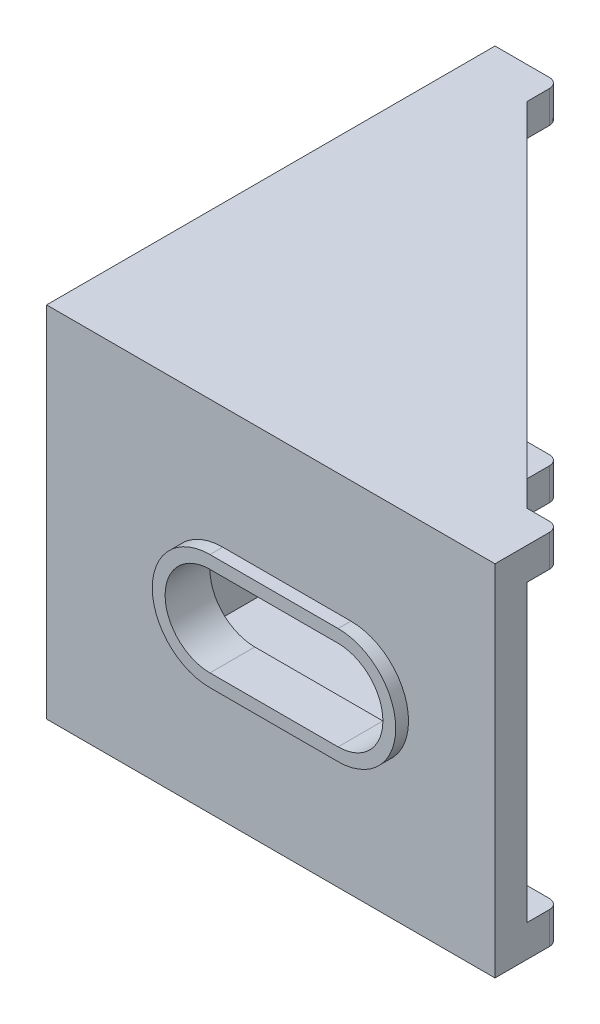
ISO-10303-21;
HEADER;
FILE_DESCRIPTION(('STEP AP214'),'2;1');
FILE_NAME('part.step','',(''),(''),'','','');
FILE_SCHEMA(('AUTOMOTIVE_DESIGN { 1 0 10303 214 1 1 1 1 }'));
ENDSEC;
DATA;
#1=APPLICATION_CONTEXT('core data for automotive mechanical design processes');
#2=APPLICATION_PROTOCOL_DEFINITION('international standard','automotive_design',2000,#1);
#3=PRODUCT_CONTEXT('',#1,'mechanical');
#4=PRODUCT('Part','Part','',(#3));
#5=PRODUCT_RELATED_PRODUCT_CATEGORY('part','',(#4));
#6=PRODUCT_DEFINITION_FORMATION('','',#4);
#7=PRODUCT_DEFINITION_CONTEXT('part definition',#1,'design');
#8=PRODUCT_DEFINITION('design','',#6,#7);
#9=PRODUCT_DEFINITION_SHAPE('','',#8);
#10=(LENGTH_UNIT() NAMED_UNIT(*) SI_UNIT(.MILLI.,.METRE.));
#11=(NAMED_UNIT(*) PLANE_ANGLE_UNIT() SI_UNIT($,.RADIAN.));
#12=(NAMED_UNIT(*) SI_UNIT($,.STERADIAN.) SOLID_ANGLE_UNIT());
#13=UNCERTAINTY_MEASURE_WITH_UNIT(LENGTH_MEASURE(1.E-05),#10,'distance_accuracy_value','');
#14=(GEOMETRIC_REPRESENTATION_CONTEXT(3) GLOBAL_UNCERTAINTY_ASSIGNED_CONTEXT((#13)) GLOBAL_UNIT_ASSIGNED_CONTEXT((#10,
#11,#12)) REPRESENTATION_CONTEXT('',''));
#15=CARTESIAN_POINT('',(0.,0.,0.));
#16=DIRECTION('',(0.,0.,1.));
#17=DIRECTION('',(1.,0.,0.));
#18=AXIS2_PLACEMENT_3D('',#15,#16,#17);
#19=CARTESIAN_POINT('',(0.,28.,0.));
#20=DIRECTION('',(1.,0.,0.));
#21=DIRECTION('',(0.,0.,-1.));
#22=AXIS2_PLACEMENT_3D('',#19,#20,#21);
#23=PLANE('',#22);
#24=DIRECTION('',(0.,0.,1.));
#25=VECTOR('',#24,1.);
#26=CARTESIAN_POINT('',(0.,0.,0.));
#27=LINE('',#26,#25);
#28=CARTESIAN_POINT('',(0.,0.,-35.));
#29=VERTEX_POINT('',#28);
#30=CARTESIAN_POINT('',(0.,0.,0.));
#31=VERTEX_POINT('',#30);
#32=EDGE_CURVE('E503',#29,#31,#27,.T.);
#33=ORIENTED_EDGE('',*,*,#32,.T.);
#34=DIRECTION('',(0.,-1.,0.));
#35=VECTOR('',#34,1.);
#36=CARTESIAN_POINT('',(0.,28.,0.));
#37=LINE('',#36,#35);
#38=CARTESIAN_POINT('',(0.,28.,0.));
#39=VERTEX_POINT('',#38);
#40=EDGE_CURVE('E509',#39,#31,#37,.T.);
#41=ORIENTED_EDGE('',*,*,#40,.F.);
#42=DIRECTION('',(0.,0.,1.));
#43=VECTOR('',#42,1.);
#44=CARTESIAN_POINT('',(0.,28.,0.));
#45=LINE('',#44,#43);
#46=CARTESIAN_POINT('',(0.,28.,-35.));
#47=VERTEX_POINT('',#46);
#48=EDGE_CURVE('E507',#47,#39,#45,.T.);
#49=ORIENTED_EDGE('',*,*,#48,.F.);
#50=DIRECTION('',(0.,-1.,0.));
#51=VECTOR('',#50,1.);
#52=CARTESIAN_POINT('',(0.,28.,-35.));
#53=LINE('',#52,#51);
#54=EDGE_CURVE('E519',#47,#29,#53,.T.);
#55=ORIENTED_EDGE('',*,*,#54,.T.);
#56=EDGE_LOOP('',(#33,#41,#49,#55));
#57=FACE_BOUND('',#56,.T.);
#58=CARTESIAN_POINT('',(0.,14.,-23.75));
#59=DIRECTION('',(-1.,0.,0.));
#60=DIRECTION('',(0.,0.,1.));
#61=AXIS2_PLACEMENT_3D('',#58,#59,#60);
#62=CIRCLE('',#61,4.5);
#63=CARTESIAN_POINT('',(0.,18.5,-23.75));
#64=VERTEX_POINT('',#63);
#65=CARTESIAN_POINT('',(0.,9.5,-23.75));
#66=VERTEX_POINT('',#65);
#67=EDGE_CURVE('E283',#64,#66,#62,.T.);
#68=ORIENTED_EDGE('',*,*,#67,.F.);
#69=DIRECTION('',(0.,0.,-1.));
#70=VECTOR('',#69,1.);
#71=CARTESIAN_POINT('',(0.,18.5,-23.75));
#72=LINE('',#71,#70);
#73=CARTESIAN_POINT('',(0.,18.5,-13.75));
#74=VERTEX_POINT('',#73);
#75=EDGE_CURVE('E288',#74,#64,#72,.T.);
#76=ORIENTED_EDGE('',*,*,#75,.F.);
#77=CARTESIAN_POINT('',(0.,14.,-13.75));
#78=DIRECTION('',(-1.,0.,0.));
#79=DIRECTION('',(0.,0.,1.));
#80=AXIS2_PLACEMENT_3D('',#77,#78,#79);
#81=CIRCLE('',#80,4.5);
#82=CARTESIAN_POINT('',(0.,9.5,-13.75));
#83=VERTEX_POINT('',#82);
#84=EDGE_CURVE('E54',#83,#74,#81,.T.);
#85=ORIENTED_EDGE('',*,*,#84,.F.);
#86=DIRECTION('',(0.,0.,1.));
#87=VECTOR('',#86,1.);
#88=CARTESIAN_POINT('',(0.,9.5,-13.75));
#89=LINE('',#88,#87);
#90=EDGE_CURVE('E49',#66,#83,#89,.T.);
#91=ORIENTED_EDGE('',*,*,#90,.F.);
#92=EDGE_LOOP('',(#68,#76,#85,#91));
#93=FACE_BOUND('',#92,.T.);
#94=ADVANCED_FACE('F34',(#57,#93),#23,.F.);
#95=CARTESIAN_POINT('',(0.,28.,0.));
#96=DIRECTION('',(0.,0.,-1.));
#97=DIRECTION('',(-1.,0.,0.));
#98=AXIS2_PLACEMENT_3D('',#95,#96,#97);
#99=PLANE('',#98);
#100=DIRECTION('',(1.,0.,0.));
#101=VECTOR('',#100,1.);
#102=CARTESIAN_POINT('',(0.,0.,0.));
#103=LINE('',#102,#101);
#104=CARTESIAN_POINT('',(35.,0.,0.));
#105=VERTEX_POINT('',#104);
#106=EDGE_CURVE('E488',#31,#105,#103,.T.);
#107=ORIENTED_EDGE('',*,*,#106,.T.);
#108=DIRECTION('',(0.,-1.,0.));
#109=VECTOR('',#108,1.);
#110=CARTESIAN_POINT('',(35.,28.,0.));
#111=LINE('',#110,#109);
#112=CARTESIAN_POINT('',(35.,28.,0.));
#113=VERTEX_POINT('',#112);
#114=EDGE_CURVE('E11',#113,#105,#111,.T.);
#115=ORIENTED_EDGE('',*,*,#114,.F.);
#116=DIRECTION('',(1.,0.,0.));
#117=VECTOR('',#116,1.);
#118=CARTESIAN_POINT('',(0.,28.,0.));
#119=LINE('',#118,#117);
#120=EDGE_CURVE('E499',#39,#113,#119,.T.);
#121=ORIENTED_EDGE('',*,*,#120,.F.);
#122=ORIENTED_EDGE('',*,*,#40,.T.);
#123=EDGE_LOOP('',(#107,#115,#121,#122));
#124=FACE_BOUND('',#123,.T.);
#125=CARTESIAN_POINT('',(13.75,14.,0.));
#126=DIRECTION('',(0.,0.,1.));
#127=DIRECTION('',(1.,0.,0.));
#128=AXIS2_PLACEMENT_3D('',#125,#126,#127);
#129=CIRCLE('',#128,4.5);
#130=CARTESIAN_POINT('',(13.75,18.5,0.));
#131=VERTEX_POINT('',#130);
#132=CARTESIAN_POINT('',(13.75,9.5,0.));
#133=VERTEX_POINT('',#132);
#134=EDGE_CURVE('E323',#131,#133,#129,.T.);
#135=ORIENTED_EDGE('',*,*,#134,.F.);
#136=DIRECTION('',(-1.,0.,0.));
#137=VECTOR('',#136,1.);
#138=CARTESIAN_POINT('',(13.75,18.5,0.));
#139=LINE('',#138,#137);
#140=CARTESIAN_POINT('',(23.75,18.5,0.));
#141=VERTEX_POINT('',#140);
#142=EDGE_CURVE('E328',#141,#131,#139,.T.);
#143=ORIENTED_EDGE('',*,*,#142,.F.);
#144=CARTESIAN_POINT('',(23.75,14.,0.));
#145=DIRECTION('',(0.,0.,1.));
#146=DIRECTION('',(1.,0.,0.));
#147=AXIS2_PLACEMENT_3D('',#144,#145,#146);
#148=CIRCLE('',#147,4.5);
#149=CARTESIAN_POINT('',(23.75,9.5,0.));
#150=VERTEX_POINT('',#149);
#151=EDGE_CURVE('E340',#150,#141,#148,.T.);
#152=ORIENTED_EDGE('',*,*,#151,.F.);
#153=DIRECTION('',(1.,0.,0.));
#154=VECTOR('',#153,1.);
#155=CARTESIAN_POINT('',(23.75,9.5,0.));
#156=LINE('',#155,#154);
#157=EDGE_CURVE('E337',#133,#150,#156,.T.);
#158=ORIENTED_EDGE('',*,*,#157,.F.);
#159=EDGE_LOOP('',(#135,#143,#152,#158));
#160=FACE_BOUND('',#159,.T.);
#161=ADVANCED_FACE('F36',(#124,#160),#99,.F.);
#162=CARTESIAN_POINT('',(2.5,28.,-2.5));
#163=DIRECTION('',(0.,0.,1.));
#164=DIRECTION('',(1.,0.,0.));
#165=AXIS2_PLACEMENT_3D('',#162,#163,#164);
#166=PLANE('',#165);
#167=DIRECTION('',(-1.,0.,0.));
#168=VECTOR('',#167,1.);
#169=CARTESIAN_POINT('',(23.75,10.5,-2.5));
#170=LINE('',#169,#168);
#171=CARTESIAN_POINT('',(23.75,10.5,-2.5));
#172=VERTEX_POINT('',#171);
#173=CARTESIAN_POINT('',(13.75,10.5,-2.5));
#174=VERTEX_POINT('',#173);
#175=EDGE_CURVE('E370',#172,#174,#170,.T.);
#176=ORIENTED_EDGE('',*,*,#175,.F.);
#177=CARTESIAN_POINT('',(23.75,14.,-2.5));
#178=DIRECTION('',(0.,0.,-1.));
#179=DIRECTION('',(-1.,0.,0.));
#180=AXIS2_PLACEMENT_3D('',#177,#178,#179);
#181=CIRCLE('',#180,3.5);
#182=CARTESIAN_POINT('',(23.75,17.5,-2.5));
#183=VERTEX_POINT('',#182);
#184=EDGE_CURVE('E263',#183,#172,#181,.T.);
#185=ORIENTED_EDGE('',*,*,#184,.F.);
#186=DIRECTION('',(1.,0.,0.));
#187=VECTOR('',#186,1.);
#188=CARTESIAN_POINT('',(23.75,17.5,-2.5));
#189=LINE('',#188,#187);
#190=CARTESIAN_POINT('',(13.75,17.5,-2.5));
#191=VERTEX_POINT('',#190);
#192=EDGE_CURVE('E376',#191,#183,#189,.T.);
#193=ORIENTED_EDGE('',*,*,#192,.F.);
#194=CARTESIAN_POINT('',(13.75,14.,-2.5));
#195=DIRECTION('',(0.,0.,-1.));
#196=DIRECTION('',(-1.,0.,0.));
#197=AXIS2_PLACEMENT_3D('',#194,#195,#196);
#198=CIRCLE('',#197,3.5);
#199=EDGE_CURVE('E373',#174,#191,#198,.T.);
#200=ORIENTED_EDGE('',*,*,#199,.F.);
#201=EDGE_LOOP('',(#176,#185,#193,#200));
#202=FACE_BOUND('',#201,.T.);
#203=DIRECTION('',(-1.,0.,0.));
#204=VECTOR('',#203,1.);
#205=CARTESIAN_POINT('',(0.,2.5,-2.5));
#206=LINE('',#205,#204);
#207=CARTESIAN_POINT('',(35.,2.5,-2.5));
#208=VERTEX_POINT('',#207);
#209=CARTESIAN_POINT('',(2.5,2.5,-2.5));
#210=VERTEX_POINT('',#209);
#211=EDGE_CURVE('E405',#208,#210,#206,.T.);
#212=ORIENTED_EDGE('',*,*,#211,.T.);
#213=DIRECTION('',(0.,-1.,0.));
#214=VECTOR('',#213,1.);
#215=CARTESIAN_POINT('',(2.5,28.,-2.5));
#216=LINE('',#215,#214);
#217=CARTESIAN_POINT('',(2.5,25.5,-2.5));
#218=VERTEX_POINT('',#217);
#219=EDGE_CURVE('E525',#218,#210,#216,.T.);
#220=ORIENTED_EDGE('',*,*,#219,.F.);
#221=DIRECTION('',(1.,0.,0.));
#222=VECTOR('',#221,1.);
#223=CARTESIAN_POINT('',(35.,25.5,-2.5));
#224=LINE('',#223,#222);
#225=CARTESIAN_POINT('',(35.,25.5,-2.5));
#226=VERTEX_POINT('',#225);
#227=EDGE_CURVE('E446',#218,#226,#224,.T.);
#228=ORIENTED_EDGE('',*,*,#227,.T.);
#229=DIRECTION('',(0.,-1.,0.));
#230=VECTOR('',#229,1.);
#231=CARTESIAN_POINT('',(35.,28.,-2.5));
#232=LINE('',#231,#230);
#233=EDGE_CURVE('E42',#226,#208,#232,.T.);
#234=ORIENTED_EDGE('',*,*,#233,.T.);
#235=EDGE_LOOP('',(#212,#220,#228,#234));
#236=FACE_BOUND('',#235,.T.);
#237=ADVANCED_FACE('F530',(#202,#236),#166,.F.);
#238=CARTESIAN_POINT('',(2.5,28.,-2.5));
#239=DIRECTION('',(-1.,0.,0.));
#240=DIRECTION('',(0.,0.,1.));
#241=AXIS2_PLACEMENT_3D('',#238,#239,#240);
#242=PLANE('',#241);
#243=DIRECTION('',(0.,0.,-1.));
#244=VECTOR('',#243,1.);
#245=CARTESIAN_POINT('',(2.5,10.5,-13.75));
#246=LINE('',#245,#244);
#247=CARTESIAN_POINT('',(2.5,10.5,-13.75));
#248=VERTEX_POINT('',#247);
#249=CARTESIAN_POINT('',(2.5,10.5,-23.75));
#250=VERTEX_POINT('',#249);
#251=EDGE_CURVE('E358',#248,#250,#246,.T.);
#252=ORIENTED_EDGE('',*,*,#251,.F.);
#253=CARTESIAN_POINT('',(2.5,14.,-13.75));
#254=DIRECTION('',(1.,0.,0.));
#255=DIRECTION('',(0.,0.,-1.));
#256=AXIS2_PLACEMENT_3D('',#253,#254,#255);
#257=CIRCLE('',#256,3.5);
#258=CARTESIAN_POINT('',(2.5,17.5,-13.75));
#259=VERTEX_POINT('',#258);
#260=EDGE_CURVE('E356',#259,#248,#257,.T.);
#261=ORIENTED_EDGE('',*,*,#260,.F.);
#262=DIRECTION('',(0.,0.,1.));
#263=VECTOR('',#262,1.);
#264=CARTESIAN_POINT('',(2.5,17.5,-13.75));
#265=LINE('',#264,#263);
#266=CARTESIAN_POINT('',(2.5,17.5,-23.75));
#267=VERTEX_POINT('',#266);
#268=EDGE_CURVE('E260',#267,#259,#265,.T.);
#269=ORIENTED_EDGE('',*,*,#268,.F.);
#270=CARTESIAN_POINT('',(2.5,14.,-23.75));
#271=DIRECTION('',(1.,0.,0.));
#272=DIRECTION('',(0.,0.,-1.));
#273=AXIS2_PLACEMENT_3D('',#270,#271,#272);
#274=CIRCLE('',#273,3.5);
#275=EDGE_CURVE('E361',#250,#267,#274,.T.);
#276=ORIENTED_EDGE('',*,*,#275,.F.);
#277=EDGE_LOOP('',(#252,#261,#269,#276));
#278=FACE_BOUND('',#277,.T.);
#279=DIRECTION('',(0.,0.,-1.));
#280=VECTOR('',#279,1.);
#281=CARTESIAN_POINT('',(2.5,2.5,0.));
#282=LINE('',#281,#280);
#283=CARTESIAN_POINT('',(2.5,2.5,-35.));
#284=VERTEX_POINT('',#283);
#285=EDGE_CURVE('E407',#210,#284,#282,.T.);
#286=ORIENTED_EDGE('',*,*,#285,.T.);
#287=DIRECTION('',(0.,-1.,0.));
#288=VECTOR('',#287,1.);
#289=CARTESIAN_POINT('',(2.5,28.,-35.));
#290=LINE('',#289,#288);
#291=CARTESIAN_POINT('',(2.5,25.5,-35.));
#292=VERTEX_POINT('',#291);
#293=EDGE_CURVE('E522',#292,#284,#290,.T.);
#294=ORIENTED_EDGE('',*,*,#293,.F.);
#295=DIRECTION('',(0.,0.,1.));
#296=VECTOR('',#295,1.);
#297=CARTESIAN_POINT('',(2.5,25.5,-2.5));
#298=LINE('',#297,#296);
#299=EDGE_CURVE('E443',#292,#218,#298,.T.);
#300=ORIENTED_EDGE('',*,*,#299,.T.);
#301=ORIENTED_EDGE('',*,*,#219,.T.);
#302=EDGE_LOOP('',(#286,#294,#300,#301));
#303=FACE_BOUND('',#302,.T.);
#304=ADVANCED_FACE('F567',(#278,#303),#242,.F.);
#305=CARTESIAN_POINT('',(35.,28.,-2.5));
#306=DIRECTION('',(-1.,0.,0.));
#307=DIRECTION('',(0.,0.,1.));
#308=AXIS2_PLACEMENT_3D('',#305,#306,#307);
#309=PLANE('',#308);
#310=DIRECTION('',(0.,0.,-1.));
#311=VECTOR('',#310,1.);
#312=CARTESIAN_POINT('',(35.,0.,-2.5));
#313=LINE('',#312,#311);
#314=CARTESIAN_POINT('',(35.,0.,-4.24999999999999));
#315=VERTEX_POINT('',#314);
#316=EDGE_CURVE('E512',#105,#315,#313,.T.);
#317=ORIENTED_EDGE('',*,*,#316,.T.);
#318=DIRECTION('',(0.,-1.,0.));
#319=VECTOR('',#318,1.);
#320=CARTESIAN_POINT('',(35.,2.5,-4.24999999999999));
#321=LINE('',#320,#319);
#322=CARTESIAN_POINT('',(35.,2.5,-4.24999999999999));
#323=VERTEX_POINT('',#322);
#324=EDGE_CURVE('E435',#323,#315,#321,.T.);
#325=ORIENTED_EDGE('',*,*,#324,.F.);
#326=DIRECTION('',(0.,0.,1.));
#327=VECTOR('',#326,1.);
#328=CARTESIAN_POINT('',(35.,2.5,0.));
#329=LINE('',#328,#327);
#330=EDGE_CURVE('E402',#323,#208,#329,.T.);
#331=ORIENTED_EDGE('',*,*,#330,.T.);
#332=ORIENTED_EDGE('',*,*,#233,.F.);
#333=DIRECTION('',(0.,0.,-1.));
#334=VECTOR('',#333,1.);
#335=CARTESIAN_POINT('',(35.,25.5,-4.24999999999999));
#336=LINE('',#335,#334);
#337=CARTESIAN_POINT('',(35.,25.5,-4.24999999999999));
#338=VERTEX_POINT('',#337);
#339=EDGE_CURVE('E450',#226,#338,#336,.T.);
#340=ORIENTED_EDGE('',*,*,#339,.T.);
#341=DIRECTION('',(0.,1.,0.));
#342=VECTOR('',#341,1.);
#343=CARTESIAN_POINT('',(35.,25.5,-4.24999999999999));
#344=LINE('',#343,#342);
#345=CARTESIAN_POINT('',(35.,28.,-4.24999999999999));
#346=VERTEX_POINT('',#345);
#347=EDGE_CURVE('E471',#338,#346,#344,.T.);
#348=ORIENTED_EDGE('',*,*,#347,.T.);
#349=DIRECTION('',(0.,0.,-1.));
#350=VECTOR('',#349,1.);
#351=CARTESIAN_POINT('',(35.,28.,-2.5));
#352=LINE('',#351,#350);
#353=EDGE_CURVE('E502',#113,#346,#352,.T.);
#354=ORIENTED_EDGE('',*,*,#353,.F.);
#355=ORIENTED_EDGE('',*,*,#114,.T.);
#356=EDGE_LOOP('',(#317,#325,#331,#332,#340,#348,#354,#355));
#357=FACE_BOUND('',#356,.T.);
#358=ADVANCED_FACE('F540',(#357),#309,.F.);
#359=CARTESIAN_POINT('',(0.,28.,-35.));
#360=DIRECTION('',(0.,0.,1.));
#361=DIRECTION('',(1.,0.,0.));
#362=AXIS2_PLACEMENT_3D('',#359,#360,#361);
#363=PLANE('',#362);
#364=DIRECTION('',(-1.,0.,0.));
#365=VECTOR('',#364,1.);
#366=CARTESIAN_POINT('',(0.,0.,-35.));
#367=LINE('',#366,#365);
#368=CARTESIAN_POINT('',(4.24999999999999,0.,-35.));
#369=VERTEX_POINT('',#368);
#370=EDGE_CURVE('E514',#369,#29,#367,.T.);
#371=ORIENTED_EDGE('',*,*,#370,.T.);
#372=ORIENTED_EDGE('',*,*,#54,.F.);
#373=DIRECTION('',(-1.,0.,0.));
#374=VECTOR('',#373,1.);
#375=CARTESIAN_POINT('',(0.,28.,-35.));
#376=LINE('',#375,#374);
#377=CARTESIAN_POINT('',(4.24999999999999,28.,-35.));
#378=VERTEX_POINT('',#377);
#379=EDGE_CURVE('E505',#378,#47,#376,.T.);
#380=ORIENTED_EDGE('',*,*,#379,.F.);
#381=DIRECTION('',(0.,1.,0.));
#382=VECTOR('',#381,1.);
#383=CARTESIAN_POINT('',(4.24999999999999,25.5,-35.));
#384=LINE('',#383,#382);
#385=CARTESIAN_POINT('',(4.24999999999999,25.5,-35.));
#386=VERTEX_POINT('',#385);
#387=EDGE_CURVE('E485',#386,#378,#384,.T.);
#388=ORIENTED_EDGE('',*,*,#387,.F.);
#389=DIRECTION('',(-1.,0.,0.));
#390=VECTOR('',#389,1.);
#391=CARTESIAN_POINT('',(2.5,25.5,-35.));
#392=LINE('',#391,#390);
#393=EDGE_CURVE('E468',#386,#292,#392,.T.);
#394=ORIENTED_EDGE('',*,*,#393,.T.);
#395=ORIENTED_EDGE('',*,*,#293,.T.);
#396=DIRECTION('',(1.,0.,0.));
#397=VECTOR('',#396,1.);
#398=CARTESIAN_POINT('',(0.,2.5,-35.));
#399=LINE('',#398,#397);
#400=CARTESIAN_POINT('',(4.24999999999999,2.5,-35.));
#401=VERTEX_POINT('',#400);
#402=EDGE_CURVE('E409',#284,#401,#399,.T.);
#403=ORIENTED_EDGE('',*,*,#402,.T.);
#404=DIRECTION('',(0.,-1.,0.));
#405=VECTOR('',#404,1.);
#406=CARTESIAN_POINT('',(4.24999999999999,2.5,-35.));
#407=LINE('',#406,#405);
#408=EDGE_CURVE('E432',#401,#369,#407,.T.);
#409=ORIENTED_EDGE('',*,*,#408,.T.);
#410=EDGE_LOOP('',(#371,#372,#380,#388,#394,#395,#403,#409));
#411=FACE_BOUND('',#410,.T.);
#412=ADVANCED_FACE('F563',(#411),#363,.F.);
#413=CARTESIAN_POINT('',(0.,28.,0.));
#414=DIRECTION('',(0.,-1.,0.));
#415=DIRECTION('',(0.,0.,-1.));
#416=AXIS2_PLACEMENT_3D('',#413,#414,#415);
#417=PLANE('',#416);
#418=CARTESIAN_POINT('',(4.25,28.,-34.25));
#419=DIRECTION('',(0.,1.,0.));
#420=DIRECTION('',(0.,0.,-1.));
#421=AXIS2_PLACEMENT_3D('',#418,#419,#420);
#422=CIRCLE('',#421,0.75);
#423=CARTESIAN_POINT('',(5.,28.,-34.25));
#424=VERTEX_POINT('',#423);
#425=EDGE_CURVE('E447',#424,#378,#422,.T.);
#426=ORIENTED_EDGE('',*,*,#425,.T.);
#427=ORIENTED_EDGE('',*,*,#379,.T.);
#428=ORIENTED_EDGE('',*,*,#48,.T.);
#429=ORIENTED_EDGE('',*,*,#120,.T.);
#430=ORIENTED_EDGE('',*,*,#353,.T.);
#431=CARTESIAN_POINT('',(34.25,28.,-4.25));
#432=DIRECTION('',(0.,1.,0.));
#433=DIRECTION('',(0.,0.,-1.));
#434=AXIS2_PLACEMENT_3D('',#431,#432,#433);
#435=CIRCLE('',#434,0.75);
#436=CARTESIAN_POINT('',(34.25,28.,-5.));
#437=VERTEX_POINT('',#436);
#438=EDGE_CURVE('E431',#346,#437,#435,.T.);
#439=ORIENTED_EDGE('',*,*,#438,.T.);
#440=DIRECTION('',(-1.,0.,0.));
#441=VECTOR('',#440,1.);
#442=CARTESIAN_POINT('',(32.5,28.,-5.));
#443=LINE('',#442,#441);
#444=CARTESIAN_POINT('',(32.5,28.,-5.));
#445=VERTEX_POINT('',#444);
#446=EDGE_CURVE('E474',#437,#445,#443,.T.);
#447=ORIENTED_EDGE('',*,*,#446,.T.);
#448=DIRECTION('',(-0.707106781186544,0.,-0.707106781186551));
#449=VECTOR('',#448,1.);
#450=CARTESIAN_POINT('',(5.,28.,-32.5000000000002));
#451=LINE('',#450,#449);
#452=CARTESIAN_POINT('',(5.,28.,-32.5000000000002));
#453=VERTEX_POINT('',#452);
#454=EDGE_CURVE('E477',#445,#453,#451,.T.);
#455=ORIENTED_EDGE('',*,*,#454,.T.);
#456=DIRECTION('',(0.,0.,-1.));
#457=VECTOR('',#456,1.);
#458=CARTESIAN_POINT('',(5.,28.,-34.25));
#459=LINE('',#458,#457);
#460=EDGE_CURVE('E480',#453,#424,#459,.T.);
#461=ORIENTED_EDGE('',*,*,#460,.T.);
#462=EDGE_LOOP('',(#426,#427,#428,#429,#430,#439,#447,#455,#461));
#463=FACE_BOUND('',#462,.T.);
#464=ADVANCED_FACE('F578',(#463),#417,.F.);
#465=CARTESIAN_POINT('',(0.,0.,0.));
#466=DIRECTION('',(0.,-1.,0.));
#467=DIRECTION('',(0.,0.,-1.));
#468=AXIS2_PLACEMENT_3D('',#465,#466,#467);
#469=PLANE('',#468);
#470=ORIENTED_EDGE('',*,*,#370,.F.);
#471=CARTESIAN_POINT('',(4.25,0.,-34.25));
#472=DIRECTION('',(0.,-1.,0.));
#473=DIRECTION('',(0.,0.,-1.));
#474=AXIS2_PLACEMENT_3D('',#471,#472,#473);
#475=CIRCLE('',#474,0.75);
#476=CARTESIAN_POINT('',(5.,0.,-34.25));
#477=VERTEX_POINT('',#476);
#478=EDGE_CURVE('E393',#369,#477,#475,.T.);
#479=ORIENTED_EDGE('',*,*,#478,.T.);
#480=DIRECTION('',(0.,0.,1.));
#481=VECTOR('',#480,1.);
#482=CARTESIAN_POINT('',(5.,0.,0.));
#483=LINE('',#482,#481);
#484=CARTESIAN_POINT('',(5.,0.,-32.5000000000002));
#485=VERTEX_POINT('',#484);
#486=EDGE_CURVE('E382',#477,#485,#483,.T.);
#487=ORIENTED_EDGE('',*,*,#486,.T.);
#488=DIRECTION('',(0.707106781186544,0.,0.707106781186551));
#489=VECTOR('',#488,1.);
#490=CARTESIAN_POINT('',(18.7500000000001,0.,-18.75));
#491=LINE('',#490,#489);
#492=CARTESIAN_POINT('',(32.5,0.,-5.));
#493=VERTEX_POINT('',#492);
#494=EDGE_CURVE('E418',#485,#493,#491,.T.);
#495=ORIENTED_EDGE('',*,*,#494,.T.);
#496=DIRECTION('',(1.,0.,0.));
#497=VECTOR('',#496,1.);
#498=CARTESIAN_POINT('',(0.,0.,-5.));
#499=LINE('',#498,#497);
#500=CARTESIAN_POINT('',(34.25,0.,-5.));
#501=VERTEX_POINT('',#500);
#502=EDGE_CURVE('E421',#493,#501,#499,.T.);
#503=ORIENTED_EDGE('',*,*,#502,.T.);
#504=CARTESIAN_POINT('',(34.25,0.,-4.25));
#505=DIRECTION('',(0.,-1.,0.));
#506=DIRECTION('',(0.,0.,-1.));
#507=AXIS2_PLACEMENT_3D('',#504,#505,#506);
#508=CIRCLE('',#507,0.75);
#509=EDGE_CURVE('E424',#501,#315,#508,.T.);
#510=ORIENTED_EDGE('',*,*,#509,.T.);
#511=ORIENTED_EDGE('',*,*,#316,.F.);
#512=ORIENTED_EDGE('',*,*,#106,.F.);
#513=ORIENTED_EDGE('',*,*,#32,.F.);
#514=EDGE_LOOP('',(#470,#479,#487,#495,#503,#510,#511,#512,#513));
#515=FACE_BOUND('',#514,.T.);
#516=ADVANCED_FACE('F545',(#515),#469,.T.);
#517=CARTESIAN_POINT('',(4.25,25.5,-34.25));
#518=DIRECTION('',(0.,1.,0.));
#519=DIRECTION('',(0.,0.,1.));
#520=AXIS2_PLACEMENT_3D('',#517,#518,#519);
#521=CYLINDRICAL_SURFACE('',#520,0.75);
#522=ORIENTED_EDGE('',*,*,#425,.F.);
#523=DIRECTION('',(0.,1.,0.));
#524=VECTOR('',#523,1.);
#525=CARTESIAN_POINT('',(5.,25.5,-34.25));
#526=LINE('',#525,#524);
#527=CARTESIAN_POINT('',(5.,25.5,-34.25));
#528=VERTEX_POINT('',#527);
#529=EDGE_CURVE('E489',#528,#424,#526,.T.);
#530=ORIENTED_EDGE('',*,*,#529,.F.);
#531=CARTESIAN_POINT('',(4.25,25.5,-34.25));
#532=DIRECTION('',(0.,1.,0.));
#533=DIRECTION('',(0.,0.,-1.));
#534=AXIS2_PLACEMENT_3D('',#531,#532,#533);
#535=CIRCLE('',#534,0.75);
#536=EDGE_CURVE('E465',#528,#386,#535,.T.);
#537=ORIENTED_EDGE('',*,*,#536,.T.);
#538=ORIENTED_EDGE('',*,*,#387,.T.);
#539=EDGE_LOOP('',(#522,#530,#537,#538));
#540=FACE_BOUND('',#539,.T.);
#541=ADVANCED_FACE('F590',(#540),#521,.T.);
#542=CARTESIAN_POINT('',(5.,25.5,-34.25));
#543=DIRECTION('',(1.,0.,0.));
#544=DIRECTION('',(0.,0.,-1.));
#545=AXIS2_PLACEMENT_3D('',#542,#543,#544);
#546=PLANE('',#545);
#547=ORIENTED_EDGE('',*,*,#460,.F.);
#548=DIRECTION('',(0.,1.,0.));
#549=VECTOR('',#548,1.);
#550=CARTESIAN_POINT('',(5.,25.5,-32.5000000000002));
#551=LINE('',#550,#549);
#552=CARTESIAN_POINT('',(5.,25.5,-32.5000000000002));
#553=VERTEX_POINT('',#552);
#554=EDGE_CURVE('E491',#553,#453,#551,.T.);
#555=ORIENTED_EDGE('',*,*,#554,.F.);
#556=DIRECTION('',(0.,0.,-1.));
#557=VECTOR('',#556,1.);
#558=CARTESIAN_POINT('',(5.,25.5,-34.25));
#559=LINE('',#558,#557);
#560=EDGE_CURVE('E462',#553,#528,#559,.T.);
#561=ORIENTED_EDGE('',*,*,#560,.T.);
#562=ORIENTED_EDGE('',*,*,#529,.T.);
#563=EDGE_LOOP('',(#547,#555,#561,#562));
#564=FACE_BOUND('',#563,.T.);
#565=ADVANCED_FACE('F594',(#564),#546,.T.);
#566=CARTESIAN_POINT('',(5.,25.5,-32.5000000000002));
#567=DIRECTION('',(0.707106781186551,0.,-0.707106781186544));
#568=DIRECTION('',(-0.707106781186544,0.,-0.707106781186551));
#569=AXIS2_PLACEMENT_3D('',#566,#567,#568);
#570=PLANE('',#569);
#571=ORIENTED_EDGE('',*,*,#454,.F.);
#572=DIRECTION('',(0.,1.,0.));
#573=VECTOR('',#572,1.);
#574=CARTESIAN_POINT('',(32.5,25.5,-5.));
#575=LINE('',#574,#573);
#576=CARTESIAN_POINT('',(32.5,25.5,-5.));
#577=VERTEX_POINT('',#576);
#578=EDGE_CURVE('E493',#577,#445,#575,.T.);
#579=ORIENTED_EDGE('',*,*,#578,.F.);
#580=DIRECTION('',(-0.707106781186544,0.,-0.707106781186551));
#581=VECTOR('',#580,1.);
#582=CARTESIAN_POINT('',(5.,25.5,-32.5000000000002));
#583=LINE('',#582,#581);
#584=EDGE_CURVE('E459',#577,#553,#583,.T.);
#585=ORIENTED_EDGE('',*,*,#584,.T.);
#586=ORIENTED_EDGE('',*,*,#554,.T.);
#587=EDGE_LOOP('',(#571,#579,#585,#586));
#588=FACE_BOUND('',#587,.T.);
#589=ADVANCED_FACE('F598',(#588),#570,.T.);
#590=CARTESIAN_POINT('',(32.5,25.5,-5.));
#591=DIRECTION('',(0.,0.,-1.));
#592=DIRECTION('',(-1.,0.,0.));
#593=AXIS2_PLACEMENT_3D('',#590,#591,#592);
#594=PLANE('',#593);
#595=ORIENTED_EDGE('',*,*,#446,.F.);
#596=DIRECTION('',(0.,1.,0.));
#597=VECTOR('',#596,1.);
#598=CARTESIAN_POINT('',(34.25,25.5,-5.));
#599=LINE('',#598,#597);
#600=CARTESIAN_POINT('',(34.25,25.5,-5.));
#601=VERTEX_POINT('',#600);
#602=EDGE_CURVE('E495',#601,#437,#599,.T.);
#603=ORIENTED_EDGE('',*,*,#602,.F.);
#604=DIRECTION('',(-1.,0.,0.));
#605=VECTOR('',#604,1.);
#606=CARTESIAN_POINT('',(32.5,25.5,-5.));
#607=LINE('',#606,#605);
#608=EDGE_CURVE('E456',#601,#577,#607,.T.);
#609=ORIENTED_EDGE('',*,*,#608,.T.);
#610=ORIENTED_EDGE('',*,*,#578,.T.);
#611=EDGE_LOOP('',(#595,#603,#609,#610));
#612=FACE_BOUND('',#611,.T.);
#613=ADVANCED_FACE('F600',(#612),#594,.T.);
#614=CARTESIAN_POINT('',(34.25,25.5,-4.25));
#615=DIRECTION('',(0.,1.,0.));
#616=DIRECTION('',(0.,0.,1.));
#617=AXIS2_PLACEMENT_3D('',#614,#615,#616);
#618=CYLINDRICAL_SURFACE('',#617,0.75);
#619=ORIENTED_EDGE('',*,*,#438,.F.);
#620=ORIENTED_EDGE('',*,*,#347,.F.);
#621=CARTESIAN_POINT('',(34.25,25.5,-4.25));
#622=DIRECTION('',(0.,1.,0.));
#623=DIRECTION('',(0.,0.,-1.));
#624=AXIS2_PLACEMENT_3D('',#621,#622,#623);
#625=CIRCLE('',#624,0.75);
#626=EDGE_CURVE('E453',#338,#601,#625,.T.);
#627=ORIENTED_EDGE('',*,*,#626,.T.);
#628=ORIENTED_EDGE('',*,*,#602,.T.);
#629=EDGE_LOOP('',(#619,#620,#627,#628));
#630=FACE_BOUND('',#629,.T.);
#631=ADVANCED_FACE('F575',(#630),#618,.T.);
#632=CARTESIAN_POINT('',(4.25,25.5,-34.25));
#633=DIRECTION('',(0.,-1.,0.));
#634=DIRECTION('',(0.,0.,-1.));
#635=AXIS2_PLACEMENT_3D('',#632,#633,#634);
#636=PLANE('',#635);
#637=ORIENTED_EDGE('',*,*,#299,.F.);
#638=ORIENTED_EDGE('',*,*,#393,.F.);
#639=ORIENTED_EDGE('',*,*,#536,.F.);
#640=ORIENTED_EDGE('',*,*,#560,.F.);
#641=ORIENTED_EDGE('',*,*,#584,.F.);
#642=ORIENTED_EDGE('',*,*,#608,.F.);
#643=ORIENTED_EDGE('',*,*,#626,.F.);
#644=ORIENTED_EDGE('',*,*,#339,.F.);
#645=ORIENTED_EDGE('',*,*,#227,.F.);
#646=EDGE_LOOP('',(#637,#638,#639,#640,#641,#642,#643,#644,#645));
#647=FACE_BOUND('',#646,.T.);
#648=ADVANCED_FACE('F569',(#647),#636,.T.);
#649=CARTESIAN_POINT('',(5.,2.5,0.));
#650=DIRECTION('',(1.,0.,0.));
#651=DIRECTION('',(0.,0.,-1.));
#652=AXIS2_PLACEMENT_3D('',#649,#650,#651);
#653=PLANE('',#652);
#654=ORIENTED_EDGE('',*,*,#486,.F.);
#655=DIRECTION('',(0.,-1.,0.));
#656=VECTOR('',#655,1.);
#657=CARTESIAN_POINT('',(5.,2.5,-34.25));
#658=LINE('',#657,#656);
#659=CARTESIAN_POINT('',(5.,2.5,-34.25));
#660=VERTEX_POINT('',#659);
#661=EDGE_CURVE('E429',#660,#477,#658,.T.);
#662=ORIENTED_EDGE('',*,*,#661,.F.);
#663=DIRECTION('',(0.,0.,1.));
#664=VECTOR('',#663,1.);
#665=CARTESIAN_POINT('',(5.,2.5,0.));
#666=LINE('',#665,#664);
#667=CARTESIAN_POINT('',(5.,2.5,-32.5000000000002));
#668=VERTEX_POINT('',#667);
#669=EDGE_CURVE('E389',#660,#668,#666,.T.);
#670=ORIENTED_EDGE('',*,*,#669,.T.);
#671=DIRECTION('',(0.,-1.,0.));
#672=VECTOR('',#671,1.);
#673=CARTESIAN_POINT('',(5.,2.5,-32.5000000000002));
#674=LINE('',#673,#672);
#675=EDGE_CURVE('E415',#668,#485,#674,.T.);
#676=ORIENTED_EDGE('',*,*,#675,.T.);
#677=EDGE_LOOP('',(#654,#662,#670,#676));
#678=FACE_BOUND('',#677,.T.);
#679=ADVANCED_FACE('F557',(#678),#653,.T.);
#680=CARTESIAN_POINT('',(4.25,2.5,-34.25));
#681=DIRECTION('',(0.,-1.,0.));
#682=DIRECTION('',(0.,0.,-1.));
#683=AXIS2_PLACEMENT_3D('',#680,#681,#682);
#684=CYLINDRICAL_SURFACE('',#683,0.75);
#685=ORIENTED_EDGE('',*,*,#478,.F.);
#686=ORIENTED_EDGE('',*,*,#408,.F.);
#687=CARTESIAN_POINT('',(4.25,2.5,-34.25));
#688=DIRECTION('',(0.,-1.,0.));
#689=DIRECTION('',(0.,0.,-1.));
#690=AXIS2_PLACEMENT_3D('',#687,#688,#689);
#691=CIRCLE('',#690,0.75);
#692=EDGE_CURVE('E412',#401,#660,#691,.T.);
#693=ORIENTED_EDGE('',*,*,#692,.T.);
#694=ORIENTED_EDGE('',*,*,#661,.T.);
#695=EDGE_LOOP('',(#685,#686,#693,#694));
#696=FACE_BOUND('',#695,.T.);
#697=ADVANCED_FACE('F561',(#696),#684,.T.);
#698=CARTESIAN_POINT('',(34.25,2.5,-4.25));
#699=DIRECTION('',(0.,-1.,0.));
#700=DIRECTION('',(0.,0.,-1.));
#701=AXIS2_PLACEMENT_3D('',#698,#699,#700);
#702=CYLINDRICAL_SURFACE('',#701,0.75);
#703=ORIENTED_EDGE('',*,*,#509,.F.);
#704=DIRECTION('',(0.,-1.,0.));
#705=VECTOR('',#704,1.);
#706=CARTESIAN_POINT('',(34.25,2.5,-5.));
#707=LINE('',#706,#705);
#708=CARTESIAN_POINT('',(34.25,2.5,-5.));
#709=VERTEX_POINT('',#708);
#710=EDGE_CURVE('E438',#709,#501,#707,.T.);
#711=ORIENTED_EDGE('',*,*,#710,.F.);
#712=CARTESIAN_POINT('',(34.25,2.5,-4.25));
#713=DIRECTION('',(0.,-1.,0.));
#714=DIRECTION('',(0.,0.,-1.));
#715=AXIS2_PLACEMENT_3D('',#712,#713,#714);
#716=CIRCLE('',#715,0.75);
#717=EDGE_CURVE('E399',#709,#323,#716,.T.);
#718=ORIENTED_EDGE('',*,*,#717,.T.);
#719=ORIENTED_EDGE('',*,*,#324,.T.);
#720=EDGE_LOOP('',(#703,#711,#718,#719));
#721=FACE_BOUND('',#720,.T.);
#722=ADVANCED_FACE('F543',(#721),#702,.T.);
#723=CARTESIAN_POINT('',(0.,2.5,-5.));
#724=DIRECTION('',(0.,0.,-1.));
#725=DIRECTION('',(-1.,0.,0.));
#726=AXIS2_PLACEMENT_3D('',#723,#724,#725);
#727=PLANE('',#726);
#728=ORIENTED_EDGE('',*,*,#502,.F.);
#729=DIRECTION('',(0.,-1.,0.));
#730=VECTOR('',#729,1.);
#731=CARTESIAN_POINT('',(32.5,2.5,-5.));
#732=LINE('',#731,#730);
#733=CARTESIAN_POINT('',(32.5,2.5,-5.));
#734=VERTEX_POINT('',#733);
#735=EDGE_CURVE('E440',#734,#493,#732,.T.);
#736=ORIENTED_EDGE('',*,*,#735,.F.);
#737=DIRECTION('',(1.,0.,0.));
#738=VECTOR('',#737,1.);
#739=CARTESIAN_POINT('',(0.,2.5,-5.));
#740=LINE('',#739,#738);
#741=EDGE_CURVE('E396',#734,#709,#740,.T.);
#742=ORIENTED_EDGE('',*,*,#741,.T.);
#743=ORIENTED_EDGE('',*,*,#710,.T.);
#744=EDGE_LOOP('',(#728,#736,#742,#743));
#745=FACE_BOUND('',#744,.T.);
#746=ADVANCED_FACE('F550',(#745),#727,.T.);
#747=CARTESIAN_POINT('',(18.7500000000001,2.5,-18.75));
#748=DIRECTION('',(0.707106781186551,0.,-0.707106781186544));
#749=DIRECTION('',(-0.707106781186544,0.,-0.707106781186551));
#750=AXIS2_PLACEMENT_3D('',#747,#748,#749);
#751=PLANE('',#750);
#752=ORIENTED_EDGE('',*,*,#494,.F.);
#753=ORIENTED_EDGE('',*,*,#675,.F.);
#754=DIRECTION('',(0.707106781186544,0.,0.707106781186551));
#755=VECTOR('',#754,1.);
#756=CARTESIAN_POINT('',(18.7500000000001,2.5,-18.75));
#757=LINE('',#756,#755);
#758=EDGE_CURVE('E392',#668,#734,#757,.T.);
#759=ORIENTED_EDGE('',*,*,#758,.T.);
#760=ORIENTED_EDGE('',*,*,#735,.T.);
#761=EDGE_LOOP('',(#752,#753,#759,#760));
#762=FACE_BOUND('',#761,.T.);
#763=ADVANCED_FACE('F554',(#762),#751,.T.);
#764=CARTESIAN_POINT('',(34.25,2.5,-4.25));
#765=DIRECTION('',(0.,-1.,0.));
#766=DIRECTION('',(0.,0.,-1.));
#767=AXIS2_PLACEMENT_3D('',#764,#765,#766);
#768=PLANE('',#767);
#769=ORIENTED_EDGE('',*,*,#669,.F.);
#770=ORIENTED_EDGE('',*,*,#692,.F.);
#771=ORIENTED_EDGE('',*,*,#402,.F.);
#772=ORIENTED_EDGE('',*,*,#285,.F.);
#773=ORIENTED_EDGE('',*,*,#211,.F.);
#774=ORIENTED_EDGE('',*,*,#330,.F.);
#775=ORIENTED_EDGE('',*,*,#717,.F.);
#776=ORIENTED_EDGE('',*,*,#741,.F.);
#777=ORIENTED_EDGE('',*,*,#758,.F.);
#778=EDGE_LOOP('',(#769,#770,#771,#772,#773,#774,#775,#776,#777));
#779=FACE_BOUND('',#778,.T.);
#780=ADVANCED_FACE('F537',(#779),#768,.F.);
#781=CARTESIAN_POINT('',(23.75,14.,0.));
#782=DIRECTION('',(0.,0.,-1.));
#783=DIRECTION('',(-1.,0.,0.));
#784=AXIS2_PLACEMENT_3D('',#781,#782,#783);
#785=CYLINDRICAL_SURFACE('',#784,3.5);
#786=ORIENTED_EDGE('',*,*,#184,.T.);
#787=DIRECTION('',(0.,0.,-1.));
#788=VECTOR('',#787,1.);
#789=CARTESIAN_POINT('',(23.75,10.5,0.));
#790=LINE('',#789,#788);
#791=CARTESIAN_POINT('',(23.75,10.5,1.));
#792=VERTEX_POINT('',#791);
#793=EDGE_CURVE('E379',#792,#172,#790,.T.);
#794=ORIENTED_EDGE('',*,*,#793,.F.);
#795=CARTESIAN_POINT('',(23.75,14.,1.));
#796=DIRECTION('',(0.,0.,1.));
#797=DIRECTION('',(1.,0.,0.));
#798=AXIS2_PLACEMENT_3D('',#795,#796,#797);
#799=CIRCLE('',#798,3.5);
#800=CARTESIAN_POINT('',(23.75,17.5,1.));
#801=VERTEX_POINT('',#800);
#802=EDGE_CURVE('E317',#792,#801,#799,.T.);
#803=ORIENTED_EDGE('',*,*,#802,.T.);
#804=DIRECTION('',(0.,0.,-1.));
#805=VECTOR('',#804,1.);
#806=CARTESIAN_POINT('',(23.75,17.5,0.));
#807=LINE('',#806,#805);
#808=EDGE_CURVE('E380',#801,#183,#807,.T.);
#809=ORIENTED_EDGE('',*,*,#808,.T.);
#810=EDGE_LOOP('',(#786,#794,#803,#809));
#811=FACE_BOUND('',#810,.T.);
#812=ADVANCED_FACE('F716',(#811),#785,.F.);
#813=CARTESIAN_POINT('',(23.75,17.5,0.));
#814=DIRECTION('',(0.,1.,0.));
#815=DIRECTION('',(-1.,0.,0.));
#816=AXIS2_PLACEMENT_3D('',#813,#814,#815);
#817=PLANE('',#816);
#818=ORIENTED_EDGE('',*,*,#192,.T.);
#819=ORIENTED_EDGE('',*,*,#808,.F.);
#820=DIRECTION('',(-1.,0.,0.));
#821=VECTOR('',#820,1.);
#822=CARTESIAN_POINT('',(13.75,17.5,1.));
#823=LINE('',#822,#821);
#824=CARTESIAN_POINT('',(13.75,17.5,1.));
#825=VERTEX_POINT('',#824);
#826=EDGE_CURVE('E320',#801,#825,#823,.T.);
#827=ORIENTED_EDGE('',*,*,#826,.T.);
#828=DIRECTION('',(0.,0.,-1.));
#829=VECTOR('',#828,1.);
#830=CARTESIAN_POINT('',(13.75,17.5,0.));
#831=LINE('',#830,#829);
#832=EDGE_CURVE('E383',#825,#191,#831,.T.);
#833=ORIENTED_EDGE('',*,*,#832,.T.);
#834=EDGE_LOOP('',(#818,#819,#827,#833));
#835=FACE_BOUND('',#834,.T.);
#836=ADVANCED_FACE('F724',(#835),#817,.F.);
#837=CARTESIAN_POINT('',(13.75,14.,0.));
#838=DIRECTION('',(0.,0.,-1.));
#839=DIRECTION('',(-1.,0.,0.));
#840=AXIS2_PLACEMENT_3D('',#837,#838,#839);
#841=CYLINDRICAL_SURFACE('',#840,3.5);
#842=ORIENTED_EDGE('',*,*,#199,.T.);
#843=ORIENTED_EDGE('',*,*,#832,.F.);
#844=CARTESIAN_POINT('',(13.75,14.,1.));
#845=DIRECTION('',(0.,0.,1.));
#846=DIRECTION('',(1.,0.,0.));
#847=AXIS2_PLACEMENT_3D('',#844,#845,#846);
#848=CIRCLE('',#847,3.5);
#849=CARTESIAN_POINT('',(13.75,10.5,1.));
#850=VERTEX_POINT('',#849);
#851=EDGE_CURVE('E311',#825,#850,#848,.T.);
#852=ORIENTED_EDGE('',*,*,#851,.T.);
#853=DIRECTION('',(0.,0.,-1.));
#854=VECTOR('',#853,1.);
#855=CARTESIAN_POINT('',(13.75,10.5,0.));
#856=LINE('',#855,#854);
#857=EDGE_CURVE('E385',#850,#174,#856,.T.);
#858=ORIENTED_EDGE('',*,*,#857,.T.);
#859=EDGE_LOOP('',(#842,#843,#852,#858));
#860=FACE_BOUND('',#859,.T.);
#861=ADVANCED_FACE('F733',(#860),#841,.F.);
#862=CARTESIAN_POINT('',(23.75,10.5,0.));
#863=DIRECTION('',(0.,-1.,0.));
#864=DIRECTION('',(0.,0.,-1.));
#865=AXIS2_PLACEMENT_3D('',#862,#863,#864);
#866=PLANE('',#865);
#867=ORIENTED_EDGE('',*,*,#175,.T.);
#868=ORIENTED_EDGE('',*,*,#857,.F.);
#869=DIRECTION('',(1.,0.,0.));
#870=VECTOR('',#869,1.);
#871=CARTESIAN_POINT('',(23.75,10.5,1.));
#872=LINE('',#871,#870);
#873=EDGE_CURVE('E314',#850,#792,#872,.T.);
#874=ORIENTED_EDGE('',*,*,#873,.T.);
#875=ORIENTED_EDGE('',*,*,#793,.T.);
#876=EDGE_LOOP('',(#867,#868,#874,#875));
#877=FACE_BOUND('',#876,.T.);
#878=ADVANCED_FACE('F741',(#877),#866,.F.);
#879=CARTESIAN_POINT('',(0.,14.,-13.75));
#880=DIRECTION('',(1.,0.,0.));
#881=DIRECTION('',(0.,0.,-1.));
#882=AXIS2_PLACEMENT_3D('',#879,#880,#881);
#883=CYLINDRICAL_SURFACE('',#882,3.5);
#884=ORIENTED_EDGE('',*,*,#260,.T.);
#885=DIRECTION('',(1.,0.,0.));
#886=VECTOR('',#885,1.);
#887=CARTESIAN_POINT('',(0.,10.5,-13.75));
#888=LINE('',#887,#886);
#889=CARTESIAN_POINT('',(-1.,10.5,-13.75));
#890=VERTEX_POINT('',#889);
#891=EDGE_CURVE('E270',#890,#248,#888,.T.);
#892=ORIENTED_EDGE('',*,*,#891,.F.);
#893=CARTESIAN_POINT('',(-1.,14.,-13.75));
#894=DIRECTION('',(-1.,0.,0.));
#895=DIRECTION('',(0.,0.,1.));
#896=AXIS2_PLACEMENT_3D('',#893,#894,#895);
#897=CIRCLE('',#896,3.5);
#898=CARTESIAN_POINT('',(-1.,17.5,-13.75));
#899=VERTEX_POINT('',#898);
#900=EDGE_CURVE('E267',#890,#899,#897,.T.);
#901=ORIENTED_EDGE('',*,*,#900,.T.);
#902=DIRECTION('',(1.,0.,0.));
#903=VECTOR('',#902,1.);
#904=CARTESIAN_POINT('',(0.,17.5,-13.75));
#905=LINE('',#904,#903);
#906=EDGE_CURVE('E253',#899,#259,#905,.T.);
#907=ORIENTED_EDGE('',*,*,#906,.T.);
#908=EDGE_LOOP('',(#884,#892,#901,#907));
#909=FACE_BOUND('',#908,.T.);
#910=ADVANCED_FACE('F268',(#909),#883,.F.);
#911=CARTESIAN_POINT('',(0.,17.5,-13.75));
#912=DIRECTION('',(0.,1.,0.));
#913=DIRECTION('',(0.,0.,1.));
#914=AXIS2_PLACEMENT_3D('',#911,#912,#913);
#915=PLANE('',#914);
#916=ORIENTED_EDGE('',*,*,#268,.T.);
#917=ORIENTED_EDGE('',*,*,#906,.F.);
#918=DIRECTION('',(0.,0.,-1.));
#919=VECTOR('',#918,1.);
#920=CARTESIAN_POINT('',(-1.,17.5,-23.75));
#921=LINE('',#920,#919);
#922=CARTESIAN_POINT('',(-1.,17.5,-23.75));
#923=VERTEX_POINT('',#922);
#924=EDGE_CURVE('E257',#899,#923,#921,.T.);
#925=ORIENTED_EDGE('',*,*,#924,.T.);
#926=DIRECTION('',(1.,0.,0.));
#927=VECTOR('',#926,1.);
#928=CARTESIAN_POINT('',(0.,17.5,-23.75));
#929=LINE('',#928,#927);
#930=EDGE_CURVE('E264',#923,#267,#929,.T.);
#931=ORIENTED_EDGE('',*,*,#930,.T.);
#932=EDGE_LOOP('',(#916,#917,#925,#931));
#933=FACE_BOUND('',#932,.T.);
#934=ADVANCED_FACE('F255',(#933),#915,.F.);
#935=CARTESIAN_POINT('',(0.,14.,-23.75));
#936=DIRECTION('',(1.,0.,0.));
#937=DIRECTION('',(0.,0.,-1.));
#938=AXIS2_PLACEMENT_3D('',#935,#936,#937);
#939=CYLINDRICAL_SURFACE('',#938,3.5);
#940=ORIENTED_EDGE('',*,*,#275,.T.);
#941=ORIENTED_EDGE('',*,*,#930,.F.);
#942=CARTESIAN_POINT('',(-1.,14.,-23.75));
#943=DIRECTION('',(-1.,0.,0.));
#944=DIRECTION('',(0.,0.,1.));
#945=AXIS2_PLACEMENT_3D('',#942,#943,#944);
#946=CIRCLE('',#945,3.5);
#947=CARTESIAN_POINT('',(-1.,10.5,-23.75));
#948=VERTEX_POINT('',#947);
#949=EDGE_CURVE('E277',#923,#948,#946,.T.);
#950=ORIENTED_EDGE('',*,*,#949,.T.);
#951=DIRECTION('',(1.,0.,0.));
#952=VECTOR('',#951,1.);
#953=CARTESIAN_POINT('',(0.,10.5,-23.75));
#954=LINE('',#953,#952);
#955=EDGE_CURVE('E366',#948,#250,#954,.T.);
#956=ORIENTED_EDGE('',*,*,#955,.T.);
#957=EDGE_LOOP('',(#940,#941,#950,#956));
#958=FACE_BOUND('',#957,.T.);
#959=ADVANCED_FACE('F763',(#958),#939,.F.);
#960=CARTESIAN_POINT('',(0.,10.5,-13.75));
#961=DIRECTION('',(0.,-1.,0.));
#962=DIRECTION('',(0.,0.,-1.));
#963=AXIS2_PLACEMENT_3D('',#960,#961,#962);
#964=PLANE('',#963);
#965=ORIENTED_EDGE('',*,*,#251,.T.);
#966=ORIENTED_EDGE('',*,*,#955,.F.);
#967=DIRECTION('',(0.,0.,1.));
#968=VECTOR('',#967,1.);
#969=CARTESIAN_POINT('',(-1.,10.5,-13.75));
#970=LINE('',#969,#968);
#971=EDGE_CURVE('E279',#948,#890,#970,.T.);
#972=ORIENTED_EDGE('',*,*,#971,.T.);
#973=ORIENTED_EDGE('',*,*,#891,.T.);
#974=EDGE_LOOP('',(#965,#966,#972,#973));
#975=FACE_BOUND('',#974,.T.);
#976=ADVANCED_FACE('F770',(#975),#964,.F.);
#977=CARTESIAN_POINT('',(13.75,14.,1.));
#978=DIRECTION('',(0.,0.,1.));
#979=DIRECTION('',(1.,0.,0.));
#980=AXIS2_PLACEMENT_3D('',#977,#978,#979);
#981=PLANE('',#980);
#982=CARTESIAN_POINT('',(13.75,14.,1.));
#983=DIRECTION('',(0.,0.,1.));
#984=DIRECTION('',(1.,0.,0.));
#985=AXIS2_PLACEMENT_3D('',#982,#983,#984);
#986=CIRCLE('',#985,4.5);
#987=CARTESIAN_POINT('',(13.75,18.5,1.));
#988=VERTEX_POINT('',#987);
#989=CARTESIAN_POINT('',(13.75,9.5,1.));
#990=VERTEX_POINT('',#989);
#991=EDGE_CURVE('E324',#988,#990,#986,.T.);
#992=ORIENTED_EDGE('',*,*,#991,.T.);
#993=DIRECTION('',(1.,0.,0.));
#994=VECTOR('',#993,1.);
#995=CARTESIAN_POINT('',(23.75,9.5,1.));
#996=LINE('',#995,#994);
#997=CARTESIAN_POINT('',(23.75,9.5,1.));
#998=VERTEX_POINT('',#997);
#999=EDGE_CURVE('E327',#990,#998,#996,.T.);
#1000=ORIENTED_EDGE('',*,*,#999,.T.);
#1001=CARTESIAN_POINT('',(23.75,14.,1.));
#1002=DIRECTION('',(0.,0.,1.));
#1003=DIRECTION('',(1.,0.,0.));
#1004=AXIS2_PLACEMENT_3D('',#1001,#1002,#1003);
#1005=CIRCLE('',#1004,4.5);
#1006=CARTESIAN_POINT('',(23.75,18.5,1.));
#1007=VERTEX_POINT('',#1006);
#1008=EDGE_CURVE('E330',#998,#1007,#1005,.T.);
#1009=ORIENTED_EDGE('',*,*,#1008,.T.);
#1010=DIRECTION('',(-1.,0.,0.));
#1011=VECTOR('',#1010,1.);
#1012=CARTESIAN_POINT('',(13.75,18.5,1.));
#1013=LINE('',#1012,#1011);
#1014=EDGE_CURVE('E332',#1007,#988,#1013,.T.);
#1015=ORIENTED_EDGE('',*,*,#1014,.T.);
#1016=EDGE_LOOP('',(#992,#1000,#1009,#1015));
#1017=FACE_BOUND('',#1016,.T.);
#1018=ORIENTED_EDGE('',*,*,#873,.F.);
#1019=ORIENTED_EDGE('',*,*,#851,.F.);
#1020=ORIENTED_EDGE('',*,*,#826,.F.);
#1021=ORIENTED_EDGE('',*,*,#802,.F.);
#1022=EDGE_LOOP('',(#1018,#1019,#1020,#1021));
#1023=FACE_BOUND('',#1022,.T.);
#1024=ADVANCED_FACE('F778',(#1017,#1023),#981,.T.);
#1025=CARTESIAN_POINT('',(13.75,14.,1.));
#1026=DIRECTION('',(0.,0.,-1.));
#1027=DIRECTION('',(-1.,0.,0.));
#1028=AXIS2_PLACEMENT_3D('',#1025,#1026,#1027);
#1029=CYLINDRICAL_SURFACE('',#1028,4.5);
#1030=ORIENTED_EDGE('',*,*,#134,.T.);
#1031=DIRECTION('',(0.,0.,-1.));
#1032=VECTOR('',#1031,1.);
#1033=CARTESIAN_POINT('',(13.75,9.5,1.));
#1034=LINE('',#1033,#1032);
#1035=EDGE_CURVE('E353',#990,#133,#1034,.T.);
#1036=ORIENTED_EDGE('',*,*,#1035,.F.);
#1037=ORIENTED_EDGE('',*,*,#991,.F.);
#1038=DIRECTION('',(0.,0.,-1.));
#1039=VECTOR('',#1038,1.);
#1040=CARTESIAN_POINT('',(13.75,18.5,1.));
#1041=LINE('',#1040,#1039);
#1042=EDGE_CURVE('E334',#988,#131,#1041,.T.);
#1043=ORIENTED_EDGE('',*,*,#1042,.T.);
#1044=EDGE_LOOP('',(#1030,#1036,#1037,#1043));
#1045=FACE_BOUND('',#1044,.T.);
#1046=ADVANCED_FACE('F786',(#1045),#1029,.T.);
#1047=CARTESIAN_POINT('',(23.75,9.5,1.));
#1048=DIRECTION('',(0.,1.,0.));
#1049=DIRECTION('',(-1.,0.,0.));
#1050=AXIS2_PLACEMENT_3D('',#1047,#1048,#1049);
#1051=PLANE('',#1050);
#1052=ORIENTED_EDGE('',*,*,#157,.T.);
#1053=DIRECTION('',(0.,0.,-1.));
#1054=VECTOR('',#1053,1.);
#1055=CARTESIAN_POINT('',(23.75,9.5,1.));
#1056=LINE('',#1055,#1054);
#1057=EDGE_CURVE('E350',#998,#150,#1056,.T.);
#1058=ORIENTED_EDGE('',*,*,#1057,.F.);
#1059=ORIENTED_EDGE('',*,*,#999,.F.);
#1060=ORIENTED_EDGE('',*,*,#1035,.T.);
#1061=EDGE_LOOP('',(#1052,#1058,#1059,#1060));
#1062=FACE_BOUND('',#1061,.T.);
#1063=ADVANCED_FACE('F794',(#1062),#1051,.F.);
#1064=CARTESIAN_POINT('',(23.75,14.,1.));
#1065=DIRECTION('',(0.,0.,-1.));
#1066=DIRECTION('',(-1.,0.,0.));
#1067=AXIS2_PLACEMENT_3D('',#1064,#1065,#1066);
#1068=CYLINDRICAL_SURFACE('',#1067,4.5);
#1069=ORIENTED_EDGE('',*,*,#151,.T.);
#1070=DIRECTION('',(0.,0.,-1.));
#1071=VECTOR('',#1070,1.);
#1072=CARTESIAN_POINT('',(23.75,18.5,1.));
#1073=LINE('',#1072,#1071);
#1074=EDGE_CURVE('E347',#1007,#141,#1073,.T.);
#1075=ORIENTED_EDGE('',*,*,#1074,.F.);
#1076=ORIENTED_EDGE('',*,*,#1008,.F.);
#1077=ORIENTED_EDGE('',*,*,#1057,.T.);
#1078=EDGE_LOOP('',(#1069,#1075,#1076,#1077));
#1079=FACE_BOUND('',#1078,.T.);
#1080=ADVANCED_FACE('F802',(#1079),#1068,.T.);
#1081=CARTESIAN_POINT('',(13.75,18.5,1.));
#1082=DIRECTION('',(0.,-1.,0.));
#1083=DIRECTION('',(0.,0.,-1.));
#1084=AXIS2_PLACEMENT_3D('',#1081,#1082,#1083);
#1085=PLANE('',#1084);
#1086=ORIENTED_EDGE('',*,*,#142,.T.);
#1087=ORIENTED_EDGE('',*,*,#1042,.F.);
#1088=ORIENTED_EDGE('',*,*,#1014,.F.);
#1089=ORIENTED_EDGE('',*,*,#1074,.T.);
#1090=EDGE_LOOP('',(#1086,#1087,#1088,#1089));
#1091=FACE_BOUND('',#1090,.T.);
#1092=ADVANCED_FACE('F810',(#1091),#1085,.F.);
#1093=CARTESIAN_POINT('',(-1.,14.,-23.75));
#1094=DIRECTION('',(-1.,0.,0.));
#1095=DIRECTION('',(0.,0.,1.));
#1096=AXIS2_PLACEMENT_3D('',#1093,#1094,#1095);
#1097=PLANE('',#1096);
#1098=CARTESIAN_POINT('',(-1.,14.,-23.75));
#1099=DIRECTION('',(-1.,0.,0.));
#1100=DIRECTION('',(0.,0.,1.));
#1101=AXIS2_PLACEMENT_3D('',#1098,#1099,#1100);
#1102=CIRCLE('',#1101,4.5);
#1103=CARTESIAN_POINT('',(-1.,18.5,-23.75));
#1104=VERTEX_POINT('',#1103);
#1105=CARTESIAN_POINT('',(-1.,9.5,-23.75));
#1106=VERTEX_POINT('',#1105);
#1107=EDGE_CURVE('E284',#1104,#1106,#1102,.T.);
#1108=ORIENTED_EDGE('',*,*,#1107,.T.);
#1109=DIRECTION('',(0.,0.,1.));
#1110=VECTOR('',#1109,1.);
#1111=CARTESIAN_POINT('',(-1.,9.5,-13.75));
#1112=LINE('',#1111,#1110);
#1113=CARTESIAN_POINT('',(-1.,9.5,-13.75));
#1114=VERTEX_POINT('',#1113);
#1115=EDGE_CURVE('E287',#1106,#1114,#1112,.T.);
#1116=ORIENTED_EDGE('',*,*,#1115,.T.);
#1117=CARTESIAN_POINT('',(-1.,14.,-13.75));
#1118=DIRECTION('',(-1.,0.,0.));
#1119=DIRECTION('',(0.,0.,1.));
#1120=AXIS2_PLACEMENT_3D('',#1117,#1118,#1119);
#1121=CIRCLE('',#1120,4.5);
#1122=CARTESIAN_POINT('',(-1.,18.5,-13.75));
#1123=VERTEX_POINT('',#1122);
#1124=EDGE_CURVE('E290',#1114,#1123,#1121,.T.);
#1125=ORIENTED_EDGE('',*,*,#1124,.T.);
#1126=DIRECTION('',(0.,0.,-1.));
#1127=VECTOR('',#1126,1.);
#1128=CARTESIAN_POINT('',(-1.,18.5,-23.75));
#1129=LINE('',#1128,#1127);
#1130=EDGE_CURVE('E292',#1123,#1104,#1129,.T.);
#1131=ORIENTED_EDGE('',*,*,#1130,.T.);
#1132=EDGE_LOOP('',(#1108,#1116,#1125,#1131));
#1133=FACE_BOUND('',#1132,.T.);
#1134=ORIENTED_EDGE('',*,*,#924,.F.);
#1135=ORIENTED_EDGE('',*,*,#900,.F.);
#1136=ORIENTED_EDGE('',*,*,#971,.F.);
#1137=ORIENTED_EDGE('',*,*,#949,.F.);
#1138=EDGE_LOOP('',(#1134,#1135,#1136,#1137));
#1139=FACE_BOUND('',#1138,.T.);
#1140=ADVANCED_FACE('F275',(#1133,#1139),#1097,.T.);
#1141=CARTESIAN_POINT('',(-1.,14.,-23.75));
#1142=DIRECTION('',(1.,0.,0.));
#1143=DIRECTION('',(0.,0.,-1.));
#1144=AXIS2_PLACEMENT_3D('',#1141,#1142,#1143);
#1145=CYLINDRICAL_SURFACE('',#1144,4.5);
#1146=ORIENTED_EDGE('',*,*,#67,.T.);
#1147=DIRECTION('',(1.,0.,0.));
#1148=VECTOR('',#1147,1.);
#1149=CARTESIAN_POINT('',(-1.,9.5,-23.75));
#1150=LINE('',#1149,#1148);
#1151=EDGE_CURVE('E309',#1106,#66,#1150,.T.);
#1152=ORIENTED_EDGE('',*,*,#1151,.F.);
#1153=ORIENTED_EDGE('',*,*,#1107,.F.);
#1154=DIRECTION('',(1.,0.,0.));
#1155=VECTOR('',#1154,1.);
#1156=CARTESIAN_POINT('',(-1.,18.5,-23.75));
#1157=LINE('',#1156,#1155);
#1158=EDGE_CURVE('E294',#1104,#64,#1157,.T.);
#1159=ORIENTED_EDGE('',*,*,#1158,.T.);
#1160=EDGE_LOOP('',(#1146,#1152,#1153,#1159));
#1161=FACE_BOUND('',#1160,.T.);
#1162=ADVANCED_FACE('F824',(#1161),#1145,.T.);
#1163=CARTESIAN_POINT('',(-1.,9.5,-13.75));
#1164=DIRECTION('',(0.,1.,0.));
#1165=DIRECTION('',(0.,0.,1.));
#1166=AXIS2_PLACEMENT_3D('',#1163,#1164,#1165);
#1167=PLANE('',#1166);
#1168=ORIENTED_EDGE('',*,*,#90,.T.);
#1169=DIRECTION('',(1.,0.,0.));
#1170=VECTOR('',#1169,1.);
#1171=CARTESIAN_POINT('',(-1.,9.5,-13.75));
#1172=LINE('',#1171,#1170);
#1173=EDGE_CURVE('E306',#1114,#83,#1172,.T.);
#1174=ORIENTED_EDGE('',*,*,#1173,.F.);
#1175=ORIENTED_EDGE('',*,*,#1115,.F.);
#1176=ORIENTED_EDGE('',*,*,#1151,.T.);
#1177=EDGE_LOOP('',(#1168,#1174,#1175,#1176));
#1178=FACE_BOUND('',#1177,.T.);
#1179=ADVANCED_FACE('F832',(#1178),#1167,.F.);
#1180=CARTESIAN_POINT('',(-1.,14.,-13.75));
#1181=DIRECTION('',(1.,0.,0.));
#1182=DIRECTION('',(0.,0.,-1.));
#1183=AXIS2_PLACEMENT_3D('',#1180,#1181,#1182);
#1184=CYLINDRICAL_SURFACE('',#1183,4.5);
#1185=ORIENTED_EDGE('',*,*,#84,.T.);
#1186=DIRECTION('',(1.,0.,0.));
#1187=VECTOR('',#1186,1.);
#1188=CARTESIAN_POINT('',(-1.,18.5,-13.75));
#1189=LINE('',#1188,#1187);
#1190=EDGE_CURVE('E303',#1123,#74,#1189,.T.);
#1191=ORIENTED_EDGE('',*,*,#1190,.F.);
#1192=ORIENTED_EDGE('',*,*,#1124,.F.);
#1193=ORIENTED_EDGE('',*,*,#1173,.T.);
#1194=EDGE_LOOP('',(#1185,#1191,#1192,#1193));
#1195=FACE_BOUND('',#1194,.T.);
#1196=ADVANCED_FACE('F840',(#1195),#1184,.T.);
#1197=CARTESIAN_POINT('',(-1.,18.5,-23.75));
#1198=DIRECTION('',(0.,-1.,0.));
#1199=DIRECTION('',(0.,0.,-1.));
#1200=AXIS2_PLACEMENT_3D('',#1197,#1198,#1199);
#1201=PLANE('',#1200);
#1202=ORIENTED_EDGE('',*,*,#75,.T.);
#1203=ORIENTED_EDGE('',*,*,#1158,.F.);
#1204=ORIENTED_EDGE('',*,*,#1130,.F.);
#1205=ORIENTED_EDGE('',*,*,#1190,.T.);
#1206=EDGE_LOOP('',(#1202,#1203,#1204,#1205));
#1207=FACE_BOUND('',#1206,.T.);
#1208=ADVANCED_FACE('F848',(#1207),#1201,.F.);
#1209=CLOSED_SHELL('',(#94,#161,#237,#304,#358,#412,#464,#516,#541,#565,#589,#613,#631,#648,
#679,#697,#722,#746,#763,#780,#812,#836,#861,#878,#910,#934,#959,#976,#1024,#1046,#1063,#1080,
#1092,#1140,#1162,#1179,#1196,#1208));
#1210=MANIFOLD_SOLID_BREP('B2',#1209);
#1211=ADVANCED_BREP_SHAPE_REPRESENTATION('',(#18,#1210),#14);
#1212=SHAPE_DEFINITION_REPRESENTATION(#9,#1211);
ENDSEC;
END-ISO-10303-21;
